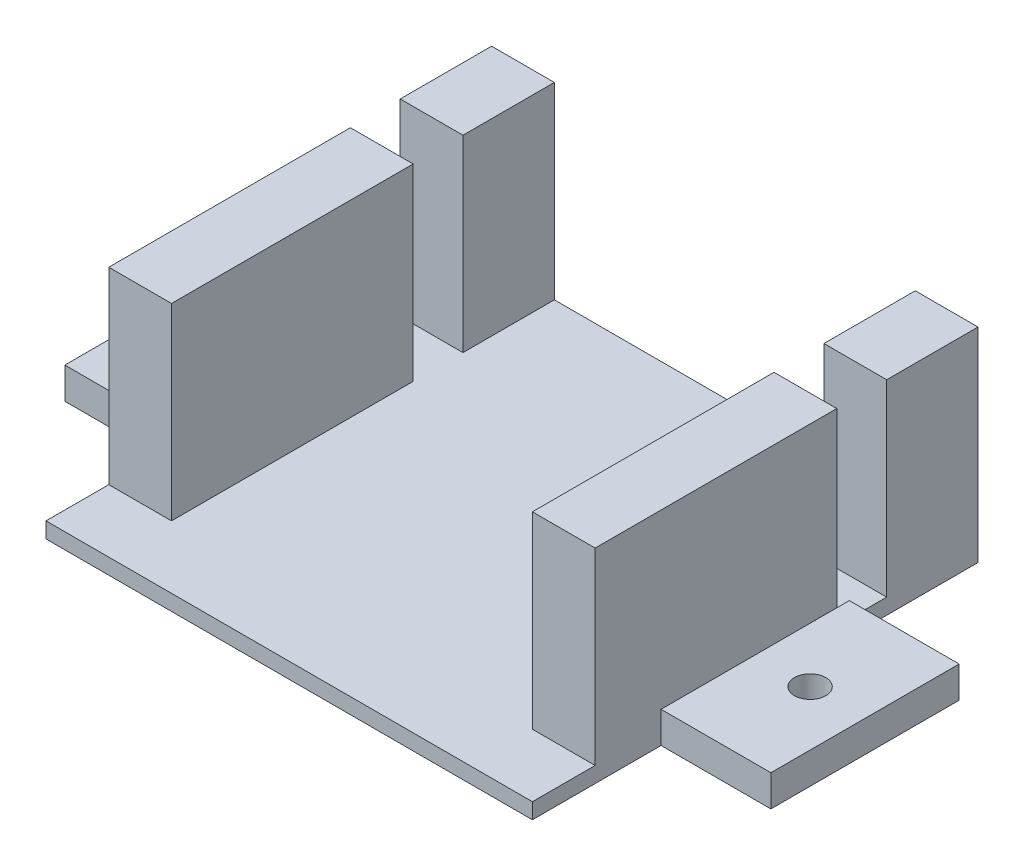
ISO-10303-21;
HEADER;
FILE_DESCRIPTION(('STEP AP214'),'2;1');
FILE_NAME('part.step','',(''),(''),'','','');
FILE_SCHEMA(('AUTOMOTIVE_DESIGN { 1 0 10303 214 1 1 1 1 }'));
ENDSEC;
DATA;
#1=APPLICATION_CONTEXT('core data for automotive mechanical design processes');
#2=APPLICATION_PROTOCOL_DEFINITION('international standard','automotive_design',2000,#1);
#3=PRODUCT_CONTEXT('',#1,'mechanical');
#4=PRODUCT('Part','Part','',(#3));
#5=PRODUCT_RELATED_PRODUCT_CATEGORY('part','',(#4));
#6=PRODUCT_DEFINITION_FORMATION('','',#4);
#7=PRODUCT_DEFINITION_CONTEXT('part definition',#1,'design');
#8=PRODUCT_DEFINITION('design','',#6,#7);
#9=PRODUCT_DEFINITION_SHAPE('','',#8);
#10=(LENGTH_UNIT() NAMED_UNIT(*) SI_UNIT(.MILLI.,.METRE.));
#11=(NAMED_UNIT(*) PLANE_ANGLE_UNIT() SI_UNIT($,.RADIAN.));
#12=(NAMED_UNIT(*) SI_UNIT($,.STERADIAN.) SOLID_ANGLE_UNIT());
#13=UNCERTAINTY_MEASURE_WITH_UNIT(LENGTH_MEASURE(1.E-05),#10,'distance_accuracy_value','');
#14=(GEOMETRIC_REPRESENTATION_CONTEXT(3) GLOBAL_UNCERTAINTY_ASSIGNED_CONTEXT((#13)) GLOBAL_UNIT_ASSIGNED_CONTEXT((#10,
#11,#12)) REPRESENTATION_CONTEXT('',''));
#15=CARTESIAN_POINT('',(0.,0.,0.));
#16=DIRECTION('',(0.,0.,1.));
#17=DIRECTION('',(1.,0.,0.));
#18=AXIS2_PLACEMENT_3D('',#15,#16,#17);
#19=CARTESIAN_POINT('',(-15.5,1.,14.2));
#20=DIRECTION('',(1.,0.,0.));
#21=DIRECTION('',(0.,0.,-1.));
#22=AXIS2_PLACEMENT_3D('',#19,#20,#21);
#23=PLANE('',#22);
#24=DIRECTION('',(0.,-1.,0.));
#25=VECTOR('',#24,1.);
#26=CARTESIAN_POINT('',(-15.5,2.,-6.));
#27=LINE('',#26,#25);
#28=CARTESIAN_POINT('',(-15.5,1.,-6.));
#29=VERTEX_POINT('',#28);
#30=CARTESIAN_POINT('',(-15.5,0.,-6.));
#31=VERTEX_POINT('',#30);
#32=EDGE_CURVE('E11',#29,#31,#27,.T.);
#33=ORIENTED_EDGE('',*,*,#32,.F.);
#34=DIRECTION('',(0.,0.,1.));
#35=VECTOR('',#34,1.);
#36=CARTESIAN_POINT('',(-15.5,1.,14.2));
#37=LINE('',#36,#35);
#38=CARTESIAN_POINT('',(-15.5,1.,-8.375));
#39=VERTEX_POINT('',#38);
#40=EDGE_CURVE('E477',#39,#29,#37,.T.);
#41=ORIENTED_EDGE('',*,*,#40,.F.);
#42=DIRECTION('',(0.,-1.,0.));
#43=VECTOR('',#42,1.);
#44=CARTESIAN_POINT('',(-15.5,13.,-8.375));
#45=LINE('',#44,#43);
#46=CARTESIAN_POINT('',(-15.5,13.,-8.375));
#47=VERTEX_POINT('',#46);
#48=EDGE_CURVE('E369',#47,#39,#45,.T.);
#49=ORIENTED_EDGE('',*,*,#48,.F.);
#50=DIRECTION('',(0.,0.,1.));
#51=VECTOR('',#50,1.);
#52=CARTESIAN_POINT('',(-15.5,13.,-14.2));
#53=LINE('',#52,#51);
#54=CARTESIAN_POINT('',(-15.5,13.,-14.2));
#55=VERTEX_POINT('',#54);
#56=EDGE_CURVE('E398',#55,#47,#53,.T.);
#57=ORIENTED_EDGE('',*,*,#56,.F.);
#58=DIRECTION('',(0.,-1.,0.));
#59=VECTOR('',#58,1.);
#60=CARTESIAN_POINT('',(-15.5,1.,-14.2));
#61=LINE('',#60,#59);
#62=CARTESIAN_POINT('',(-15.5,0.,-14.2));
#63=VERTEX_POINT('',#62);
#64=EDGE_CURVE('E505',#55,#63,#61,.T.);
#65=ORIENTED_EDGE('',*,*,#64,.T.);
#66=DIRECTION('',(0.,0.,1.));
#67=VECTOR('',#66,1.);
#68=CARTESIAN_POINT('',(-15.5,0.,14.2));
#69=LINE('',#68,#67);
#70=EDGE_CURVE('E492',#63,#31,#69,.T.);
#71=ORIENTED_EDGE('',*,*,#70,.T.);
#72=EDGE_LOOP('',(#33,#41,#49,#57,#65,#71));
#73=FACE_BOUND('',#72,.T.);
#74=ADVANCED_FACE('F45',(#73),#23,.F.);
#75=DIRECTION('',(0.,0.,-1.));
#76=VECTOR('',#75,1.);
#77=CARTESIAN_POINT('',(-15.5,2.,-6.));
#78=LINE('',#77,#76);
#79=CARTESIAN_POINT('',(-15.5,2.,6.));
#80=VERTEX_POINT('',#79);
#81=CARTESIAN_POINT('',(-15.5,2.,-5.2));
#82=VERTEX_POINT('',#81);
#83=EDGE_CURVE('E260',#80,#82,#78,.T.);
#84=ORIENTED_EDGE('',*,*,#83,.F.);
#85=DIRECTION('',(0.,-1.,0.));
#86=VECTOR('',#85,1.);
#87=CARTESIAN_POINT('',(-15.5,2.,6.));
#88=LINE('',#87,#86);
#89=CARTESIAN_POINT('',(-15.5,0.,6.));
#90=VERTEX_POINT('',#89);
#91=EDGE_CURVE('E252',#80,#90,#88,.T.);
#92=ORIENTED_EDGE('',*,*,#91,.T.);
#93=CARTESIAN_POINT('',(-15.5,0.,14.2));
#94=VERTEX_POINT('',#93);
#95=EDGE_CURVE('E258',#90,#94,#69,.T.);
#96=ORIENTED_EDGE('',*,*,#95,.T.);
#97=DIRECTION('',(0.,-1.,0.));
#98=VECTOR('',#97,1.);
#99=CARTESIAN_POINT('',(-15.5,1.,14.2));
#100=LINE('',#99,#98);
#101=CARTESIAN_POINT('',(-15.5,0.999999999999997,14.2));
#102=VERTEX_POINT('',#101);
#103=EDGE_CURVE('E502',#102,#94,#100,.T.);
#104=ORIENTED_EDGE('',*,*,#103,.F.);
#105=DIRECTION('',(0.,0.,1.));
#106=VECTOR('',#105,1.);
#107=CARTESIAN_POINT('',(-15.5,0.999999999999997,10.2));
#108=LINE('',#107,#106);
#109=CARTESIAN_POINT('',(-15.5,0.999999999999997,10.2));
#110=VERTEX_POINT('',#109);
#111=EDGE_CURVE('E320',#110,#102,#108,.T.);
#112=ORIENTED_EDGE('',*,*,#111,.F.);
#113=DIRECTION('',(0.,1.,0.));
#114=VECTOR('',#113,1.);
#115=CARTESIAN_POINT('',(-15.5,-30.2569992161756,10.2));
#116=LINE('',#115,#114);
#117=CARTESIAN_POINT('',(-15.5,13.,10.2));
#118=VERTEX_POINT('',#117);
#119=EDGE_CURVE('E325',#110,#118,#116,.T.);
#120=ORIENTED_EDGE('',*,*,#119,.T.);
#121=DIRECTION('',(0.,0.,1.));
#122=VECTOR('',#121,1.);
#123=CARTESIAN_POINT('',(-15.5,13.,14.2));
#124=LINE('',#123,#122);
#125=CARTESIAN_POINT('',(-15.5,13.,-5.2));
#126=VERTEX_POINT('',#125);
#127=EDGE_CURVE('E442',#126,#118,#124,.T.);
#128=ORIENTED_EDGE('',*,*,#127,.F.);
#129=DIRECTION('',(0.,-1.,0.));
#130=VECTOR('',#129,1.);
#131=CARTESIAN_POINT('',(-15.5,13.,-5.2));
#132=LINE('',#131,#130);
#133=EDGE_CURVE('E459',#126,#82,#132,.T.);
#134=ORIENTED_EDGE('',*,*,#133,.T.);
#135=EDGE_LOOP('',(#84,#92,#96,#104,#112,#120,#128,#134));
#136=FACE_BOUND('',#135,.T.);
#137=ADVANCED_FACE('F560',(#136),#23,.F.);
#138=CARTESIAN_POINT('',(15.5,1.,14.2));
#139=DIRECTION('',(-1.,0.,0.));
#140=DIRECTION('',(0.,0.,1.));
#141=AXIS2_PLACEMENT_3D('',#138,#139,#140);
#142=PLANE('',#141);
#143=DIRECTION('',(0.,-1.,0.));
#144=VECTOR('',#143,1.);
#145=CARTESIAN_POINT('',(15.5,2.,6.));
#146=LINE('',#145,#144);
#147=CARTESIAN_POINT('',(15.5,2.,6.));
#148=VERTEX_POINT('',#147);
#149=CARTESIAN_POINT('',(15.5,0.,6.));
#150=VERTEX_POINT('',#149);
#151=EDGE_CURVE('E311',#148,#150,#146,.T.);
#152=ORIENTED_EDGE('',*,*,#151,.F.);
#153=DIRECTION('',(0.,0.,1.));
#154=VECTOR('',#153,1.);
#155=CARTESIAN_POINT('',(15.5,2.,-6.));
#156=LINE('',#155,#154);
#157=CARTESIAN_POINT('',(15.5,2.,-5.19999999999999));
#158=VERTEX_POINT('',#157);
#159=EDGE_CURVE('E55',#158,#148,#156,.T.);
#160=ORIENTED_EDGE('',*,*,#159,.F.);
#161=DIRECTION('',(0.,-1.,0.));
#162=VECTOR('',#161,1.);
#163=CARTESIAN_POINT('',(15.5,13.,-5.2));
#164=LINE('',#163,#162);
#165=CARTESIAN_POINT('',(15.5,13.,-5.2));
#166=VERTEX_POINT('',#165);
#167=EDGE_CURVE('E415',#166,#158,#164,.T.);
#168=ORIENTED_EDGE('',*,*,#167,.F.);
#169=DIRECTION('',(0.,0.,-1.));
#170=VECTOR('',#169,1.);
#171=CARTESIAN_POINT('',(15.5,13.,14.2));
#172=LINE('',#171,#170);
#173=CARTESIAN_POINT('',(15.5,13.,10.2));
#174=VERTEX_POINT('',#173);
#175=EDGE_CURVE('E429',#174,#166,#172,.T.);
#176=ORIENTED_EDGE('',*,*,#175,.F.);
#177=DIRECTION('',(0.,1.,0.));
#178=VECTOR('',#177,1.);
#179=CARTESIAN_POINT('',(15.5,-30.2569992161756,10.2));
#180=LINE('',#179,#178);
#181=CARTESIAN_POINT('',(15.5,0.999999999999997,10.2));
#182=VERTEX_POINT('',#181);
#183=EDGE_CURVE('E334',#182,#174,#180,.T.);
#184=ORIENTED_EDGE('',*,*,#183,.F.);
#185=DIRECTION('',(0.,0.,-1.));
#186=VECTOR('',#185,1.);
#187=CARTESIAN_POINT('',(15.5,0.999999999999997,10.2));
#188=LINE('',#187,#186);
#189=CARTESIAN_POINT('',(15.5,0.999999999999997,14.2));
#190=VERTEX_POINT('',#189);
#191=EDGE_CURVE('E319',#190,#182,#188,.T.);
#192=ORIENTED_EDGE('',*,*,#191,.F.);
#193=DIRECTION('',(0.,-1.,0.));
#194=VECTOR('',#193,1.);
#195=CARTESIAN_POINT('',(15.5,1.,14.2));
#196=LINE('',#195,#194);
#197=CARTESIAN_POINT('',(15.5,0.,14.2));
#198=VERTEX_POINT('',#197);
#199=EDGE_CURVE('E484',#190,#198,#196,.T.);
#200=ORIENTED_EDGE('',*,*,#199,.T.);
#201=DIRECTION('',(0.,0.,-1.));
#202=VECTOR('',#201,1.);
#203=CARTESIAN_POINT('',(15.5,0.,14.2));
#204=LINE('',#203,#202);
#205=EDGE_CURVE('E485',#198,#150,#204,.T.);
#206=ORIENTED_EDGE('',*,*,#205,.T.);
#207=EDGE_LOOP('',(#152,#160,#168,#176,#184,#192,#200,#206));
#208=FACE_BOUND('',#207,.T.);
#209=ADVANCED_FACE('F532',(#208),#142,.F.);
#210=CARTESIAN_POINT('',(0.,1.,0.));
#211=DIRECTION('',(0.,-1.,0.));
#212=DIRECTION('',(0.,0.,-1.));
#213=AXIS2_PLACEMENT_3D('',#210,#211,#212);
#214=PLANE('',#213);
#215=DIRECTION('',(0.,0.,-1.));
#216=VECTOR('',#215,1.);
#217=CARTESIAN_POINT('',(-11.5,1.,14.2));
#218=LINE('',#217,#216);
#219=CARTESIAN_POINT('',(-11.5,0.999999999999997,10.2));
#220=VERTEX_POINT('',#219);
#221=CARTESIAN_POINT('',(-11.5,1.,-5.2));
#222=VERTEX_POINT('',#221);
#223=EDGE_CURVE('E433',#220,#222,#218,.T.);
#224=ORIENTED_EDGE('',*,*,#223,.F.);
#225=DIRECTION('',(-1.,0.,0.));
#226=VECTOR('',#225,1.);
#227=CARTESIAN_POINT('',(-15.5,0.999999999999997,10.2));
#228=LINE('',#227,#226);
#229=EDGE_CURVE('E330',#220,#110,#228,.T.);
#230=ORIENTED_EDGE('',*,*,#229,.T.);
#231=ORIENTED_EDGE('',*,*,#111,.T.);
#232=DIRECTION('',(1.,0.,0.));
#233=VECTOR('',#232,1.);
#234=CARTESIAN_POINT('',(-15.5,1.,14.2));
#235=LINE('',#234,#233);
#236=EDGE_CURVE('E481',#102,#190,#235,.T.);
#237=ORIENTED_EDGE('',*,*,#236,.T.);
#238=ORIENTED_EDGE('',*,*,#191,.T.);
#239=CARTESIAN_POINT('',(11.5,0.999999999999997,10.2));
#240=VERTEX_POINT('',#239);
#241=EDGE_CURVE('E326',#182,#240,#228,.T.);
#242=ORIENTED_EDGE('',*,*,#241,.T.);
#243=DIRECTION('',(0.,0.,1.));
#244=VECTOR('',#243,1.);
#245=CARTESIAN_POINT('',(11.5,1.,14.2));
#246=LINE('',#245,#244);
#247=CARTESIAN_POINT('',(11.5,1.,-5.2));
#248=VERTEX_POINT('',#247);
#249=EDGE_CURVE('E424',#248,#240,#246,.T.);
#250=ORIENTED_EDGE('',*,*,#249,.F.);
#251=DIRECTION('',(-1.,0.,0.));
#252=VECTOR('',#251,1.);
#253=CARTESIAN_POINT('',(15.5,1.,-5.2));
#254=LINE('',#253,#252);
#255=CARTESIAN_POINT('',(15.5,1.,-5.19999999999999));
#256=VERTEX_POINT('',#255);
#257=EDGE_CURVE('E428',#256,#248,#254,.T.);
#258=ORIENTED_EDGE('',*,*,#257,.F.);
#259=DIRECTION('',(0.,0.,-1.));
#260=VECTOR('',#259,1.);
#261=CARTESIAN_POINT('',(15.5,1.,14.2));
#262=LINE('',#261,#260);
#263=CARTESIAN_POINT('',(15.5,1.,-6.));
#264=VERTEX_POINT('',#263);
#265=EDGE_CURVE('E468',#256,#264,#262,.T.);
#266=ORIENTED_EDGE('',*,*,#265,.T.);
#267=CARTESIAN_POINT('',(15.5,1.,-8.38));
#268=VERTEX_POINT('',#267);
#269=EDGE_CURVE('E473',#264,#268,#262,.T.);
#270=ORIENTED_EDGE('',*,*,#269,.T.);
#271=DIRECTION('',(1.,0.,0.));
#272=VECTOR('',#271,1.);
#273=CARTESIAN_POINT('',(15.5,1.,-8.38));
#274=LINE('',#273,#272);
#275=CARTESIAN_POINT('',(11.5,1.,-8.38));
#276=VERTEX_POINT('',#275);
#277=EDGE_CURVE('E360',#276,#268,#274,.T.);
#278=ORIENTED_EDGE('',*,*,#277,.F.);
#279=DIRECTION('',(0.,0.,1.));
#280=VECTOR('',#279,1.);
#281=CARTESIAN_POINT('',(11.5,1.,-14.2));
#282=LINE('',#281,#280);
#283=CARTESIAN_POINT('',(11.5,1.,-14.2));
#284=VERTEX_POINT('',#283);
#285=EDGE_CURVE('E364',#284,#276,#282,.T.);
#286=ORIENTED_EDGE('',*,*,#285,.F.);
#287=DIRECTION('',(-1.,0.,0.));
#288=VECTOR('',#287,1.);
#289=CARTESIAN_POINT('',(-15.5,1.,-14.2));
#290=LINE('',#289,#288);
#291=CARTESIAN_POINT('',(-11.5,1.,-14.2));
#292=VERTEX_POINT('',#291);
#293=EDGE_CURVE('E472',#284,#292,#290,.T.);
#294=ORIENTED_EDGE('',*,*,#293,.T.);
#295=DIRECTION('',(0.,0.,-1.));
#296=VECTOR('',#295,1.);
#297=CARTESIAN_POINT('',(-11.5,1.,-14.2));
#298=LINE('',#297,#296);
#299=CARTESIAN_POINT('',(-11.5,1.,-8.375));
#300=VERTEX_POINT('',#299);
#301=EDGE_CURVE('E393',#300,#292,#298,.T.);
#302=ORIENTED_EDGE('',*,*,#301,.F.);
#303=DIRECTION('',(1.,0.,0.));
#304=VECTOR('',#303,1.);
#305=CARTESIAN_POINT('',(-15.5,1.,-8.375));
#306=LINE('',#305,#304);
#307=EDGE_CURVE('E397',#39,#300,#306,.T.);
#308=ORIENTED_EDGE('',*,*,#307,.F.);
#309=ORIENTED_EDGE('',*,*,#40,.T.);
#310=CARTESIAN_POINT('',(-15.5,1.,-5.2));
#311=VERTEX_POINT('',#310);
#312=EDGE_CURVE('E476',#29,#311,#37,.T.);
#313=ORIENTED_EDGE('',*,*,#312,.T.);
#314=DIRECTION('',(-1.,0.,0.));
#315=VECTOR('',#314,1.);
#316=CARTESIAN_POINT('',(-15.5,1.,-5.2));
#317=LINE('',#316,#315);
#318=EDGE_CURVE('E447',#222,#311,#317,.T.);
#319=ORIENTED_EDGE('',*,*,#318,.F.);
#320=EDGE_LOOP('',(#224,#230,#231,#237,#238,#242,#250,#258,#266,#270,#278,#286,#294,#302,#308,
#309,#313,#319));
#321=FACE_BOUND('',#320,.T.);
#322=ADVANCED_FACE('F635',(#321),#214,.F.);
#323=ORIENTED_EDGE('',*,*,#269,.F.);
#324=DIRECTION('',(0.,-1.,0.));
#325=VECTOR('',#324,1.);
#326=CARTESIAN_POINT('',(15.5,2.,-6.));
#327=LINE('',#326,#325);
#328=CARTESIAN_POINT('',(15.5,0.,-6.));
#329=VERTEX_POINT('',#328);
#330=EDGE_CURVE('E304',#264,#329,#327,.T.);
#331=ORIENTED_EDGE('',*,*,#330,.T.);
#332=CARTESIAN_POINT('',(15.5,0.,-14.2));
#333=VERTEX_POINT('',#332);
#334=EDGE_CURVE('E467',#329,#333,#204,.T.);
#335=ORIENTED_EDGE('',*,*,#334,.T.);
#336=DIRECTION('',(0.,-1.,0.));
#337=VECTOR('',#336,1.);
#338=CARTESIAN_POINT('',(15.5,1.,-14.2));
#339=LINE('',#338,#337);
#340=CARTESIAN_POINT('',(15.5,13.,-14.2));
#341=VERTEX_POINT('',#340);
#342=EDGE_CURVE('E49',#341,#333,#339,.T.);
#343=ORIENTED_EDGE('',*,*,#342,.F.);
#344=DIRECTION('',(0.,0.,-1.));
#345=VECTOR('',#344,1.);
#346=CARTESIAN_POINT('',(15.5,13.,-14.2));
#347=LINE('',#346,#345);
#348=CARTESIAN_POINT('',(15.5,13.,-8.38));
#349=VERTEX_POINT('',#348);
#350=EDGE_CURVE('E365',#349,#341,#347,.T.);
#351=ORIENTED_EDGE('',*,*,#350,.F.);
#352=DIRECTION('',(0.,-1.,0.));
#353=VECTOR('',#352,1.);
#354=CARTESIAN_POINT('',(15.5,13.,-8.38));
#355=LINE('',#354,#353);
#356=EDGE_CURVE('E355',#349,#268,#355,.T.);
#357=ORIENTED_EDGE('',*,*,#356,.T.);
#358=EDGE_LOOP('',(#323,#331,#335,#343,#351,#357));
#359=FACE_BOUND('',#358,.T.);
#360=ADVANCED_FACE('F47',(#359),#142,.F.);
#361=CARTESIAN_POINT('',(-15.5,1.,-14.2));
#362=DIRECTION('',(0.,0.,1.));
#363=DIRECTION('',(1.,0.,0.));
#364=AXIS2_PLACEMENT_3D('',#361,#362,#363);
#365=PLANE('',#364);
#366=DIRECTION('',(-1.,0.,0.));
#367=VECTOR('',#366,1.);
#368=CARTESIAN_POINT('',(-15.5,0.,-14.2));
#369=LINE('',#368,#367);
#370=EDGE_CURVE('E489',#333,#63,#369,.T.);
#371=ORIENTED_EDGE('',*,*,#370,.T.);
#372=ORIENTED_EDGE('',*,*,#64,.F.);
#373=DIRECTION('',(-1.,0.,0.));
#374=VECTOR('',#373,1.);
#375=CARTESIAN_POINT('',(-15.5,13.,-14.2));
#376=LINE('',#375,#374);
#377=CARTESIAN_POINT('',(-11.5,13.,-14.2));
#378=VERTEX_POINT('',#377);
#379=EDGE_CURVE('E392',#378,#55,#376,.T.);
#380=ORIENTED_EDGE('',*,*,#379,.F.);
#381=DIRECTION('',(0.,-1.,0.));
#382=VECTOR('',#381,1.);
#383=CARTESIAN_POINT('',(-11.5,13.,-14.2));
#384=LINE('',#383,#382);
#385=EDGE_CURVE('E388',#378,#292,#384,.T.);
#386=ORIENTED_EDGE('',*,*,#385,.T.);
#387=ORIENTED_EDGE('',*,*,#293,.F.);
#388=DIRECTION('',(0.,-1.,0.));
#389=VECTOR('',#388,1.);
#390=CARTESIAN_POINT('',(11.5,13.,-14.2));
#391=LINE('',#390,#389);
#392=CARTESIAN_POINT('',(11.5,13.,-14.2));
#393=VERTEX_POINT('',#392);
#394=EDGE_CURVE('E347',#393,#284,#391,.T.);
#395=ORIENTED_EDGE('',*,*,#394,.F.);
#396=DIRECTION('',(-1.,0.,0.));
#397=VECTOR('',#396,1.);
#398=CARTESIAN_POINT('',(15.5,13.,-14.2));
#399=LINE('',#398,#397);
#400=EDGE_CURVE('E375',#341,#393,#399,.T.);
#401=ORIENTED_EDGE('',*,*,#400,.F.);
#402=ORIENTED_EDGE('',*,*,#342,.T.);
#403=EDGE_LOOP('',(#371,#372,#380,#386,#387,#395,#401,#402));
#404=FACE_BOUND('',#403,.T.);
#405=ADVANCED_FACE('F627',(#404),#365,.F.);
#406=CARTESIAN_POINT('',(-15.5,1.,14.2));
#407=DIRECTION('',(0.,0.,-1.));
#408=DIRECTION('',(-1.,0.,0.));
#409=AXIS2_PLACEMENT_3D('',#406,#407,#408);
#410=PLANE('',#409);
#411=ORIENTED_EDGE('',*,*,#199,.F.);
#412=ORIENTED_EDGE('',*,*,#236,.F.);
#413=ORIENTED_EDGE('',*,*,#103,.T.);
#414=DIRECTION('',(1.,0.,0.));
#415=VECTOR('',#414,1.);
#416=CARTESIAN_POINT('',(-15.5,0.,14.2));
#417=LINE('',#416,#415);
#418=EDGE_CURVE('E496',#94,#198,#417,.T.);
#419=ORIENTED_EDGE('',*,*,#418,.T.);
#420=EDGE_LOOP('',(#411,#412,#413,#419));
#421=FACE_BOUND('',#420,.T.);
#422=ADVANCED_FACE('F625',(#421),#410,.F.);
#423=CARTESIAN_POINT('',(0.,0.,0.));
#424=DIRECTION('',(0.,-1.,0.));
#425=DIRECTION('',(0.,0.,-1.));
#426=AXIS2_PLACEMENT_3D('',#423,#424,#425);
#427=PLANE('',#426);
#428=CARTESIAN_POINT('',(-19.,0.,0.));
#429=DIRECTION('',(0.,1.,0.));
#430=DIRECTION('',(0.,0.,1.));
#431=AXIS2_PLACEMENT_3D('',#428,#429,#430);
#432=CIRCLE('',#431,1.);
#433=CARTESIAN_POINT('',(-19.,0.,1.));
#434=VERTEX_POINT('',#433);
#435=EDGE_CURVE('E578',#434,#434,#432,.T.);
#436=ORIENTED_EDGE('',*,*,#435,.T.);
#437=EDGE_LOOP('',(#436));
#438=FACE_BOUND('',#437,.T.);
#439=CARTESIAN_POINT('',(19.,0.,0.));
#440=DIRECTION('',(0.,1.,0.));
#441=DIRECTION('',(0.,0.,-1.));
#442=AXIS2_PLACEMENT_3D('',#439,#440,#441);
#443=CIRCLE('',#442,1.);
#444=CARTESIAN_POINT('',(19.,0.,-1.));
#445=VERTEX_POINT('',#444);
#446=EDGE_CURVE('E589',#445,#445,#443,.T.);
#447=ORIENTED_EDGE('',*,*,#446,.T.);
#448=EDGE_LOOP('',(#447));
#449=FACE_BOUND('',#448,.T.);
#450=ORIENTED_EDGE('',*,*,#205,.F.);
#451=ORIENTED_EDGE('',*,*,#418,.F.);
#452=ORIENTED_EDGE('',*,*,#95,.F.);
#453=DIRECTION('',(1.,0.,0.));
#454=VECTOR('',#453,1.);
#455=CARTESIAN_POINT('',(-15.5,0.,6.));
#456=LINE('',#455,#454);
#457=CARTESIAN_POINT('',(-22.5,0.,6.));
#458=VERTEX_POINT('',#457);
#459=EDGE_CURVE('E64',#458,#90,#456,.T.);
#460=ORIENTED_EDGE('',*,*,#459,.F.);
#461=DIRECTION('',(0.,0.,1.));
#462=VECTOR('',#461,1.);
#463=CARTESIAN_POINT('',(-22.5,0.,-6.));
#464=LINE('',#463,#462);
#465=CARTESIAN_POINT('',(-22.5,0.,-6.));
#466=VERTEX_POINT('',#465);
#467=EDGE_CURVE('E237',#466,#458,#464,.T.);
#468=ORIENTED_EDGE('',*,*,#467,.F.);
#469=DIRECTION('',(-1.,0.,0.));
#470=VECTOR('',#469,1.);
#471=CARTESIAN_POINT('',(-15.5,0.,-6.));
#472=LINE('',#471,#470);
#473=EDGE_CURVE('E247',#31,#466,#472,.T.);
#474=ORIENTED_EDGE('',*,*,#473,.F.);
#475=ORIENTED_EDGE('',*,*,#70,.F.);
#476=ORIENTED_EDGE('',*,*,#370,.F.);
#477=ORIENTED_EDGE('',*,*,#334,.F.);
#478=DIRECTION('',(-1.,0.,0.));
#479=VECTOR('',#478,1.);
#480=CARTESIAN_POINT('',(15.5,0.,-6.));
#481=LINE('',#480,#479);
#482=CARTESIAN_POINT('',(22.5,0.,-6.));
#483=VERTEX_POINT('',#482);
#484=EDGE_CURVE('E72',#483,#329,#481,.T.);
#485=ORIENTED_EDGE('',*,*,#484,.F.);
#486=DIRECTION('',(0.,0.,-1.));
#487=VECTOR('',#486,1.);
#488=CARTESIAN_POINT('',(22.5,0.,-6.));
#489=LINE('',#488,#487);
#490=CARTESIAN_POINT('',(22.5,0.,6.));
#491=VERTEX_POINT('',#490);
#492=EDGE_CURVE('E295',#491,#483,#489,.T.);
#493=ORIENTED_EDGE('',*,*,#492,.F.);
#494=DIRECTION('',(1.,0.,0.));
#495=VECTOR('',#494,1.);
#496=CARTESIAN_POINT('',(15.5,0.,6.));
#497=LINE('',#496,#495);
#498=EDGE_CURVE('E270',#150,#491,#497,.T.);
#499=ORIENTED_EDGE('',*,*,#498,.F.);
#500=EDGE_LOOP('',(#450,#451,#452,#460,#468,#474,#475,#476,#477,#485,#493,#499));
#501=FACE_BOUND('',#500,.T.);
#502=ADVANCED_FACE('F256',(#438,#449,#501),#427,.T.);
#503=CARTESIAN_POINT('',(-11.5,13.,14.2));
#504=DIRECTION('',(-1.,0.,0.));
#505=DIRECTION('',(0.,0.,1.));
#506=AXIS2_PLACEMENT_3D('',#503,#504,#505);
#507=PLANE('',#506);
#508=DIRECTION('',(0.,0.,-1.));
#509=VECTOR('',#508,1.);
#510=CARTESIAN_POINT('',(-11.5,13.,14.2));
#511=LINE('',#510,#509);
#512=CARTESIAN_POINT('',(-11.5,13.,10.2));
#513=VERTEX_POINT('',#512);
#514=CARTESIAN_POINT('',(-11.5,13.,-5.2));
#515=VERTEX_POINT('',#514);
#516=EDGE_CURVE('E446',#513,#515,#511,.T.);
#517=ORIENTED_EDGE('',*,*,#516,.F.);
#518=DIRECTION('',(0.,-1.,0.));
#519=VECTOR('',#518,1.);
#520=CARTESIAN_POINT('',(-11.5,13.,10.2));
#521=LINE('',#520,#519);
#522=EDGE_CURVE('E343',#513,#220,#521,.T.);
#523=ORIENTED_EDGE('',*,*,#522,.T.);
#524=ORIENTED_EDGE('',*,*,#223,.T.);
#525=DIRECTION('',(0.,-1.,0.));
#526=VECTOR('',#525,1.);
#527=CARTESIAN_POINT('',(-11.5,13.,-5.2));
#528=LINE('',#527,#526);
#529=EDGE_CURVE('E463',#515,#222,#528,.T.);
#530=ORIENTED_EDGE('',*,*,#529,.F.);
#531=EDGE_LOOP('',(#517,#523,#524,#530));
#532=FACE_BOUND('',#531,.T.);
#533=ADVANCED_FACE('F681',(#532),#507,.F.);
#534=CARTESIAN_POINT('',(-15.5,13.,-5.2));
#535=DIRECTION('',(0.,0.,1.));
#536=DIRECTION('',(1.,0.,0.));
#537=AXIS2_PLACEMENT_3D('',#534,#535,#536);
#538=PLANE('',#537);
#539=ORIENTED_EDGE('',*,*,#318,.T.);
#540=EDGE_CURVE('E453',#82,#311,#132,.T.);
#541=ORIENTED_EDGE('',*,*,#540,.F.);
#542=ORIENTED_EDGE('',*,*,#133,.F.);
#543=DIRECTION('',(-1.,0.,0.));
#544=VECTOR('',#543,1.);
#545=CARTESIAN_POINT('',(-15.5,13.,-5.2));
#546=LINE('',#545,#544);
#547=EDGE_CURVE('E450',#515,#126,#546,.T.);
#548=ORIENTED_EDGE('',*,*,#547,.F.);
#549=ORIENTED_EDGE('',*,*,#529,.T.);
#550=EDGE_LOOP('',(#539,#541,#542,#548,#549));
#551=FACE_BOUND('',#550,.T.);
#552=ADVANCED_FACE('F568',(#551),#538,.F.);
#553=CARTESIAN_POINT('',(0.,13.,0.));
#554=DIRECTION('',(0.,-1.,0.));
#555=DIRECTION('',(0.,0.,-1.));
#556=AXIS2_PLACEMENT_3D('',#553,#554,#555);
#557=PLANE('',#556);
#558=ORIENTED_EDGE('',*,*,#127,.T.);
#559=DIRECTION('',(-1.,0.,0.));
#560=VECTOR('',#559,1.);
#561=CARTESIAN_POINT('',(-15.5,13.,10.2));
#562=LINE('',#561,#560);
#563=EDGE_CURVE('E315',#513,#118,#562,.T.);
#564=ORIENTED_EDGE('',*,*,#563,.F.);
#565=ORIENTED_EDGE('',*,*,#516,.T.);
#566=ORIENTED_EDGE('',*,*,#547,.T.);
#567=EDGE_LOOP('',(#558,#564,#565,#566));
#568=FACE_BOUND('',#567,.T.);
#569=ADVANCED_FACE('F562',(#568),#557,.F.);
#570=CARTESIAN_POINT('',(15.5,13.,-5.2));
#571=DIRECTION('',(0.,0.,1.));
#572=DIRECTION('',(1.,0.,0.));
#573=AXIS2_PLACEMENT_3D('',#570,#571,#572);
#574=PLANE('',#573);
#575=ORIENTED_EDGE('',*,*,#257,.T.);
#576=DIRECTION('',(0.,-1.,0.));
#577=VECTOR('',#576,1.);
#578=CARTESIAN_POINT('',(11.5,13.,-5.2));
#579=LINE('',#578,#577);
#580=CARTESIAN_POINT('',(11.5,13.,-5.2));
#581=VERTEX_POINT('',#580);
#582=EDGE_CURVE('E419',#581,#248,#579,.T.);
#583=ORIENTED_EDGE('',*,*,#582,.F.);
#584=DIRECTION('',(-1.,0.,0.));
#585=VECTOR('',#584,1.);
#586=CARTESIAN_POINT('',(15.5,13.,-5.2));
#587=LINE('',#586,#585);
#588=EDGE_CURVE('E437',#166,#581,#587,.T.);
#589=ORIENTED_EDGE('',*,*,#588,.F.);
#590=ORIENTED_EDGE('',*,*,#167,.T.);
#591=EDGE_CURVE('E402',#158,#256,#164,.T.);
#592=ORIENTED_EDGE('',*,*,#591,.T.);
#593=EDGE_LOOP('',(#575,#583,#589,#590,#592));
#594=FACE_BOUND('',#593,.T.);
#595=ADVANCED_FACE('F667',(#594),#574,.F.);
#596=CARTESIAN_POINT('',(11.5,13.,14.2));
#597=DIRECTION('',(1.,0.,0.));
#598=DIRECTION('',(0.,0.,-1.));
#599=AXIS2_PLACEMENT_3D('',#596,#597,#598);
#600=PLANE('',#599);
#601=ORIENTED_EDGE('',*,*,#249,.T.);
#602=DIRECTION('',(0.,1.,0.));
#603=VECTOR('',#602,1.);
#604=CARTESIAN_POINT('',(11.5,13.,10.2));
#605=LINE('',#604,#603);
#606=CARTESIAN_POINT('',(11.5,13.,10.2));
#607=VERTEX_POINT('',#606);
#608=EDGE_CURVE('E324',#240,#607,#605,.T.);
#609=ORIENTED_EDGE('',*,*,#608,.T.);
#610=DIRECTION('',(0.,0.,1.));
#611=VECTOR('',#610,1.);
#612=CARTESIAN_POINT('',(11.5,13.,14.2));
#613=LINE('',#612,#611);
#614=EDGE_CURVE('E423',#581,#607,#613,.T.);
#615=ORIENTED_EDGE('',*,*,#614,.F.);
#616=ORIENTED_EDGE('',*,*,#582,.T.);
#617=EDGE_LOOP('',(#601,#609,#615,#616));
#618=FACE_BOUND('',#617,.T.);
#619=ADVANCED_FACE('F670',(#618),#600,.F.);
#620=CARTESIAN_POINT('',(0.,13.,0.));
#621=DIRECTION('',(0.,1.,0.));
#622=DIRECTION('',(0.,0.,1.));
#623=AXIS2_PLACEMENT_3D('',#620,#621,#622);
#624=PLANE('',#623);
#625=EDGE_CURVE('E316',#174,#607,#562,.T.);
#626=ORIENTED_EDGE('',*,*,#625,.F.);
#627=ORIENTED_EDGE('',*,*,#175,.T.);
#628=ORIENTED_EDGE('',*,*,#588,.T.);
#629=ORIENTED_EDGE('',*,*,#614,.T.);
#630=EDGE_LOOP('',(#626,#627,#628,#629));
#631=FACE_BOUND('',#630,.T.);
#632=ADVANCED_FACE('F663',(#631),#624,.T.);
#633=CARTESIAN_POINT('',(-15.5,13.,-8.375));
#634=DIRECTION('',(0.,0.,-1.));
#635=DIRECTION('',(-1.,0.,0.));
#636=AXIS2_PLACEMENT_3D('',#633,#634,#635);
#637=PLANE('',#636);
#638=ORIENTED_EDGE('',*,*,#307,.T.);
#639=DIRECTION('',(0.,-1.,0.));
#640=VECTOR('',#639,1.);
#641=CARTESIAN_POINT('',(-11.5,13.,-8.375));
#642=LINE('',#641,#640);
#643=CARTESIAN_POINT('',(-11.5,13.,-8.375));
#644=VERTEX_POINT('',#643);
#645=EDGE_CURVE('E384',#644,#300,#642,.T.);
#646=ORIENTED_EDGE('',*,*,#645,.F.);
#647=DIRECTION('',(1.,0.,0.));
#648=VECTOR('',#647,1.);
#649=CARTESIAN_POINT('',(-15.5,13.,-8.375));
#650=LINE('',#649,#648);
#651=EDGE_CURVE('E409',#47,#644,#650,.T.);
#652=ORIENTED_EDGE('',*,*,#651,.F.);
#653=ORIENTED_EDGE('',*,*,#48,.T.);
#654=EDGE_LOOP('',(#638,#646,#652,#653));
#655=FACE_BOUND('',#654,.T.);
#656=ADVANCED_FACE('F647',(#655),#637,.F.);
#657=CARTESIAN_POINT('',(-11.5,13.,-14.2));
#658=DIRECTION('',(-1.,0.,0.));
#659=DIRECTION('',(0.,0.,1.));
#660=AXIS2_PLACEMENT_3D('',#657,#658,#659);
#661=PLANE('',#660);
#662=ORIENTED_EDGE('',*,*,#301,.T.);
#663=ORIENTED_EDGE('',*,*,#385,.F.);
#664=DIRECTION('',(0.,0.,-1.));
#665=VECTOR('',#664,1.);
#666=CARTESIAN_POINT('',(-11.5,13.,-14.2));
#667=LINE('',#666,#665);
#668=EDGE_CURVE('E406',#644,#378,#667,.T.);
#669=ORIENTED_EDGE('',*,*,#668,.F.);
#670=ORIENTED_EDGE('',*,*,#645,.T.);
#671=EDGE_LOOP('',(#662,#663,#669,#670));
#672=FACE_BOUND('',#671,.T.);
#673=ADVANCED_FACE('F655',(#672),#661,.F.);
#674=CARTESIAN_POINT('',(0.,13.,0.));
#675=DIRECTION('',(0.,1.,0.));
#676=DIRECTION('',(0.,0.,1.));
#677=AXIS2_PLACEMENT_3D('',#674,#675,#676);
#678=PLANE('',#677);
#679=ORIENTED_EDGE('',*,*,#56,.T.);
#680=ORIENTED_EDGE('',*,*,#651,.T.);
#681=ORIENTED_EDGE('',*,*,#668,.T.);
#682=ORIENTED_EDGE('',*,*,#379,.T.);
#683=EDGE_LOOP('',(#679,#680,#681,#682));
#684=FACE_BOUND('',#683,.T.);
#685=ADVANCED_FACE('F649',(#684),#678,.T.);
#686=CARTESIAN_POINT('',(11.5,13.,-14.2));
#687=DIRECTION('',(1.,0.,0.));
#688=DIRECTION('',(0.,0.,-1.));
#689=AXIS2_PLACEMENT_3D('',#686,#687,#688);
#690=PLANE('',#689);
#691=ORIENTED_EDGE('',*,*,#285,.T.);
#692=DIRECTION('',(0.,-1.,0.));
#693=VECTOR('',#692,1.);
#694=CARTESIAN_POINT('',(11.5,13.,-8.38));
#695=LINE('',#694,#693);
#696=CARTESIAN_POINT('',(11.5,13.,-8.38));
#697=VERTEX_POINT('',#696);
#698=EDGE_CURVE('E351',#697,#276,#695,.T.);
#699=ORIENTED_EDGE('',*,*,#698,.F.);
#700=DIRECTION('',(0.,0.,1.));
#701=VECTOR('',#700,1.);
#702=CARTESIAN_POINT('',(11.5,13.,-14.2));
#703=LINE('',#702,#701);
#704=EDGE_CURVE('E372',#393,#697,#703,.T.);
#705=ORIENTED_EDGE('',*,*,#704,.F.);
#706=ORIENTED_EDGE('',*,*,#394,.T.);
#707=EDGE_LOOP('',(#691,#699,#705,#706));
#708=FACE_BOUND('',#707,.T.);
#709=ADVANCED_FACE('F661',(#708),#690,.F.);
#710=CARTESIAN_POINT('',(15.5,13.,-8.38));
#711=DIRECTION('',(0.,0.,-1.));
#712=DIRECTION('',(-1.,0.,0.));
#713=AXIS2_PLACEMENT_3D('',#710,#711,#712);
#714=PLANE('',#713);
#715=ORIENTED_EDGE('',*,*,#277,.T.);
#716=ORIENTED_EDGE('',*,*,#356,.F.);
#717=DIRECTION('',(1.,0.,0.));
#718=VECTOR('',#717,1.);
#719=CARTESIAN_POINT('',(15.5,13.,-8.38));
#720=LINE('',#719,#718);
#721=EDGE_CURVE('E359',#697,#349,#720,.T.);
#722=ORIENTED_EDGE('',*,*,#721,.F.);
#723=ORIENTED_EDGE('',*,*,#698,.T.);
#724=EDGE_LOOP('',(#715,#716,#722,#723));
#725=FACE_BOUND('',#724,.T.);
#726=ADVANCED_FACE('F720',(#725),#714,.F.);
#727=CARTESIAN_POINT('',(0.,13.,0.));
#728=DIRECTION('',(0.,-1.,0.));
#729=DIRECTION('',(0.,0.,-1.));
#730=AXIS2_PLACEMENT_3D('',#727,#728,#729);
#731=PLANE('',#730);
#732=ORIENTED_EDGE('',*,*,#350,.T.);
#733=ORIENTED_EDGE('',*,*,#400,.T.);
#734=ORIENTED_EDGE('',*,*,#704,.T.);
#735=ORIENTED_EDGE('',*,*,#721,.T.);
#736=EDGE_LOOP('',(#732,#733,#734,#735));
#737=FACE_BOUND('',#736,.T.);
#738=ADVANCED_FACE('F715',(#737),#731,.F.);
#739=CARTESIAN_POINT('',(-15.5,-30.2569992161756,10.2));
#740=DIRECTION('',(0.,0.,-1.));
#741=DIRECTION('',(-1.,0.,0.));
#742=AXIS2_PLACEMENT_3D('',#739,#740,#741);
#743=PLANE('',#742);
#744=ORIENTED_EDGE('',*,*,#241,.F.);
#745=ORIENTED_EDGE('',*,*,#183,.T.);
#746=ORIENTED_EDGE('',*,*,#625,.T.);
#747=ORIENTED_EDGE('',*,*,#608,.F.);
#748=EDGE_LOOP('',(#744,#745,#746,#747));
#749=FACE_BOUND('',#748,.T.);
#750=ADVANCED_FACE('F728',(#749),#743,.F.);
#751=ORIENTED_EDGE('',*,*,#563,.T.);
#752=ORIENTED_EDGE('',*,*,#119,.F.);
#753=ORIENTED_EDGE('',*,*,#229,.F.);
#754=ORIENTED_EDGE('',*,*,#522,.F.);
#755=EDGE_LOOP('',(#751,#752,#753,#754));
#756=FACE_BOUND('',#755,.T.);
#757=ADVANCED_FACE('F553',(#756),#743,.F.);
#758=CARTESIAN_POINT('',(15.5,2.,-6.));
#759=DIRECTION('',(1.,0.,0.));
#760=DIRECTION('',(0.,0.,-1.));
#761=AXIS2_PLACEMENT_3D('',#758,#759,#760);
#762=PLANE('',#761);
#763=ORIENTED_EDGE('',*,*,#265,.F.);
#764=ORIENTED_EDGE('',*,*,#591,.F.);
#765=CARTESIAN_POINT('',(15.5,2.,-6.));
#766=VERTEX_POINT('',#765);
#767=EDGE_CURVE('E279',#766,#158,#156,.T.);
#768=ORIENTED_EDGE('',*,*,#767,.F.);
#769=EDGE_CURVE('E292',#766,#264,#327,.T.);
#770=ORIENTED_EDGE('',*,*,#769,.T.);
#771=EDGE_LOOP('',(#763,#764,#768,#770));
#772=FACE_BOUND('',#771,.T.);
#773=ADVANCED_FACE('F543',(#772),#762,.F.);
#774=CARTESIAN_POINT('',(15.5,2.,6.));
#775=DIRECTION('',(0.,0.,-1.));
#776=DIRECTION('',(-1.,0.,0.));
#777=AXIS2_PLACEMENT_3D('',#774,#775,#776);
#778=PLANE('',#777);
#779=ORIENTED_EDGE('',*,*,#498,.T.);
#780=DIRECTION('',(0.,-1.,0.));
#781=VECTOR('',#780,1.);
#782=CARTESIAN_POINT('',(22.5,2.,6.));
#783=LINE('',#782,#781);
#784=CARTESIAN_POINT('',(22.5,2.,6.));
#785=VERTEX_POINT('',#784);
#786=EDGE_CURVE('E307',#785,#491,#783,.T.);
#787=ORIENTED_EDGE('',*,*,#786,.F.);
#788=DIRECTION('',(1.,0.,0.));
#789=VECTOR('',#788,1.);
#790=CARTESIAN_POINT('',(15.5,2.,6.));
#791=LINE('',#790,#789);
#792=EDGE_CURVE('E283',#148,#785,#791,.T.);
#793=ORIENTED_EDGE('',*,*,#792,.F.);
#794=ORIENTED_EDGE('',*,*,#151,.T.);
#795=EDGE_LOOP('',(#779,#787,#793,#794));
#796=FACE_BOUND('',#795,.T.);
#797=ADVANCED_FACE('F530',(#796),#778,.F.);
#798=CARTESIAN_POINT('',(22.5,2.,-6.));
#799=DIRECTION('',(-1.,0.,0.));
#800=DIRECTION('',(0.,0.,1.));
#801=AXIS2_PLACEMENT_3D('',#798,#799,#800);
#802=PLANE('',#801);
#803=ORIENTED_EDGE('',*,*,#492,.T.);
#804=DIRECTION('',(0.,-1.,0.));
#805=VECTOR('',#804,1.);
#806=CARTESIAN_POINT('',(22.5,2.,-6.));
#807=LINE('',#806,#805);
#808=CARTESIAN_POINT('',(22.5,2.,-6.));
#809=VERTEX_POINT('',#808);
#810=EDGE_CURVE('E303',#809,#483,#807,.T.);
#811=ORIENTED_EDGE('',*,*,#810,.F.);
#812=DIRECTION('',(0.,0.,-1.));
#813=VECTOR('',#812,1.);
#814=CARTESIAN_POINT('',(22.5,2.,-6.));
#815=LINE('',#814,#813);
#816=EDGE_CURVE('E286',#785,#809,#815,.T.);
#817=ORIENTED_EDGE('',*,*,#816,.F.);
#818=ORIENTED_EDGE('',*,*,#786,.T.);
#819=EDGE_LOOP('',(#803,#811,#817,#818));
#820=FACE_BOUND('',#819,.T.);
#821=ADVANCED_FACE('F537',(#820),#802,.F.);
#822=CARTESIAN_POINT('',(15.5,2.,-6.));
#823=DIRECTION('',(0.,0.,1.));
#824=DIRECTION('',(1.,0.,0.));
#825=AXIS2_PLACEMENT_3D('',#822,#823,#824);
#826=PLANE('',#825);
#827=ORIENTED_EDGE('',*,*,#484,.T.);
#828=ORIENTED_EDGE('',*,*,#330,.F.);
#829=ORIENTED_EDGE('',*,*,#769,.F.);
#830=DIRECTION('',(-1.,0.,0.));
#831=VECTOR('',#830,1.);
#832=CARTESIAN_POINT('',(15.5,2.,-6.));
#833=LINE('',#832,#831);
#834=EDGE_CURVE('E289',#809,#766,#833,.T.);
#835=ORIENTED_EDGE('',*,*,#834,.F.);
#836=ORIENTED_EDGE('',*,*,#810,.T.);
#837=EDGE_LOOP('',(#827,#828,#829,#835,#836));
#838=FACE_BOUND('',#837,.T.);
#839=ADVANCED_FACE('F541',(#838),#826,.F.);
#840=CARTESIAN_POINT('',(0.,2.,0.));
#841=DIRECTION('',(0.,1.,0.));
#842=DIRECTION('',(0.,0.,1.));
#843=AXIS2_PLACEMENT_3D('',#840,#841,#842);
#844=PLANE('',#843);
#845=CARTESIAN_POINT('',(19.,2.,0.));
#846=DIRECTION('',(0.,1.,0.));
#847=DIRECTION('',(0.,0.,-1.));
#848=AXIS2_PLACEMENT_3D('',#845,#846,#847);
#849=CIRCLE('',#848,1.);
#850=CARTESIAN_POINT('',(19.,2.,-1.));
#851=VERTEX_POINT('',#850);
#852=EDGE_CURVE('E585',#851,#851,#849,.T.);
#853=ORIENTED_EDGE('',*,*,#852,.F.);
#854=EDGE_LOOP('',(#853));
#855=FACE_BOUND('',#854,.T.);
#856=ORIENTED_EDGE('',*,*,#767,.T.);
#857=ORIENTED_EDGE('',*,*,#159,.T.);
#858=ORIENTED_EDGE('',*,*,#792,.T.);
#859=ORIENTED_EDGE('',*,*,#816,.T.);
#860=ORIENTED_EDGE('',*,*,#834,.T.);
#861=EDGE_LOOP('',(#856,#857,#858,#859,#860));
#862=FACE_BOUND('',#861,.T.);
#863=ADVANCED_FACE('F523',(#855,#862),#844,.T.);
#864=CARTESIAN_POINT('',(-15.5,2.,-6.));
#865=DIRECTION('',(-1.,0.,0.));
#866=DIRECTION('',(0.,0.,1.));
#867=AXIS2_PLACEMENT_3D('',#864,#865,#866);
#868=PLANE('',#867);
#869=CARTESIAN_POINT('',(-15.5,2.,-6.));
#870=VERTEX_POINT('',#869);
#871=EDGE_CURVE('E264',#82,#870,#78,.T.);
#872=ORIENTED_EDGE('',*,*,#871,.F.);
#873=ORIENTED_EDGE('',*,*,#540,.T.);
#874=ORIENTED_EDGE('',*,*,#312,.F.);
#875=EDGE_CURVE('E57',#870,#29,#27,.T.);
#876=ORIENTED_EDGE('',*,*,#875,.F.);
#877=EDGE_LOOP('',(#872,#873,#874,#876));
#878=FACE_BOUND('',#877,.T.);
#879=ADVANCED_FACE('F604',(#878),#868,.F.);
#880=CARTESIAN_POINT('',(-15.5,2.,-6.));
#881=DIRECTION('',(0.,0.,1.));
#882=DIRECTION('',(1.,0.,0.));
#883=AXIS2_PLACEMENT_3D('',#880,#881,#882);
#884=PLANE('',#883);
#885=ORIENTED_EDGE('',*,*,#473,.T.);
#886=DIRECTION('',(0.,-1.,0.));
#887=VECTOR('',#886,1.);
#888=CARTESIAN_POINT('',(-22.5,2.,-6.));
#889=LINE('',#888,#887);
#890=CARTESIAN_POINT('',(-22.5,2.,-6.));
#891=VERTEX_POINT('',#890);
#892=EDGE_CURVE('E243',#891,#466,#889,.T.);
#893=ORIENTED_EDGE('',*,*,#892,.F.);
#894=DIRECTION('',(-1.,0.,0.));
#895=VECTOR('',#894,1.);
#896=CARTESIAN_POINT('',(-15.5,2.,-6.));
#897=LINE('',#896,#895);
#898=EDGE_CURVE('E276',#870,#891,#897,.T.);
#899=ORIENTED_EDGE('',*,*,#898,.F.);
#900=ORIENTED_EDGE('',*,*,#875,.T.);
#901=ORIENTED_EDGE('',*,*,#32,.T.);
#902=EDGE_LOOP('',(#885,#893,#899,#900,#901));
#903=FACE_BOUND('',#902,.T.);
#904=ADVANCED_FACE('F611',(#903),#884,.F.);
#905=CARTESIAN_POINT('',(-22.5,2.,-6.));
#906=DIRECTION('',(1.,0.,0.));
#907=DIRECTION('',(0.,0.,-1.));
#908=AXIS2_PLACEMENT_3D('',#905,#906,#907);
#909=PLANE('',#908);
#910=ORIENTED_EDGE('',*,*,#467,.T.);
#911=DIRECTION('',(0.,-1.,0.));
#912=VECTOR('',#911,1.);
#913=CARTESIAN_POINT('',(-22.5,2.,6.));
#914=LINE('',#913,#912);
#915=CARTESIAN_POINT('',(-22.5,2.,6.));
#916=VERTEX_POINT('',#915);
#917=EDGE_CURVE('E240',#916,#458,#914,.T.);
#918=ORIENTED_EDGE('',*,*,#917,.F.);
#919=DIRECTION('',(0.,0.,1.));
#920=VECTOR('',#919,1.);
#921=CARTESIAN_POINT('',(-22.5,2.,-6.));
#922=LINE('',#921,#920);
#923=EDGE_CURVE('E273',#891,#916,#922,.T.);
#924=ORIENTED_EDGE('',*,*,#923,.F.);
#925=ORIENTED_EDGE('',*,*,#892,.T.);
#926=EDGE_LOOP('',(#910,#918,#924,#925));
#927=FACE_BOUND('',#926,.T.);
#928=ADVANCED_FACE('F238',(#927),#909,.F.);
#929=CARTESIAN_POINT('',(-15.5,2.,6.));
#930=DIRECTION('',(0.,0.,-1.));
#931=DIRECTION('',(-1.,0.,0.));
#932=AXIS2_PLACEMENT_3D('',#929,#930,#931);
#933=PLANE('',#932);
#934=ORIENTED_EDGE('',*,*,#459,.T.);
#935=ORIENTED_EDGE('',*,*,#91,.F.);
#936=DIRECTION('',(1.,0.,0.));
#937=VECTOR('',#936,1.);
#938=CARTESIAN_POINT('',(-15.5,2.,6.));
#939=LINE('',#938,#937);
#940=EDGE_CURVE('E250',#916,#80,#939,.T.);
#941=ORIENTED_EDGE('',*,*,#940,.F.);
#942=ORIENTED_EDGE('',*,*,#917,.T.);
#943=EDGE_LOOP('',(#934,#935,#941,#942));
#944=FACE_BOUND('',#943,.T.);
#945=ADVANCED_FACE('F249',(#944),#933,.F.);
#946=CARTESIAN_POINT('',(0.,2.,0.));
#947=DIRECTION('',(0.,-1.,0.));
#948=DIRECTION('',(0.,0.,-1.));
#949=AXIS2_PLACEMENT_3D('',#946,#947,#948);
#950=PLANE('',#949);
#951=CARTESIAN_POINT('',(-19.,2.,0.));
#952=DIRECTION('',(0.,1.,0.));
#953=DIRECTION('',(0.,0.,1.));
#954=AXIS2_PLACEMENT_3D('',#951,#952,#953);
#955=CIRCLE('',#954,1.);
#956=CARTESIAN_POINT('',(-19.,2.,1.));
#957=VERTEX_POINT('',#956);
#958=EDGE_CURVE('E581',#957,#957,#955,.T.);
#959=ORIENTED_EDGE('',*,*,#958,.F.);
#960=EDGE_LOOP('',(#959));
#961=FACE_BOUND('',#960,.T.);
#962=ORIENTED_EDGE('',*,*,#83,.T.);
#963=ORIENTED_EDGE('',*,*,#871,.T.);
#964=ORIENTED_EDGE('',*,*,#898,.T.);
#965=ORIENTED_EDGE('',*,*,#923,.T.);
#966=ORIENTED_EDGE('',*,*,#940,.T.);
#967=EDGE_LOOP('',(#962,#963,#964,#965,#966));
#968=FACE_BOUND('',#967,.T.);
#969=ADVANCED_FACE('F570',(#961,#968),#950,.F.);
#970=CARTESIAN_POINT('',(-19.,0.,0.));
#971=DIRECTION('',(0.,1.,0.));
#972=DIRECTION('',(0.,0.,1.));
#973=AXIS2_PLACEMENT_3D('',#970,#971,#972);
#974=CYLINDRICAL_SURFACE('',#973,1.);
#975=ORIENTED_EDGE('',*,*,#435,.F.);
#976=EDGE_LOOP('',(#975));
#977=FACE_BOUND('',#976,.T.);
#978=ORIENTED_EDGE('',*,*,#958,.T.);
#979=EDGE_LOOP('',(#978));
#980=FACE_BOUND('',#979,.T.);
#981=ADVANCED_FACE('F599',(#977,#980),#974,.F.);
#982=CARTESIAN_POINT('',(19.,0.,0.));
#983=DIRECTION('',(0.,1.,0.));
#984=DIRECTION('',(0.,0.,1.));
#985=AXIS2_PLACEMENT_3D('',#982,#983,#984);
#986=CYLINDRICAL_SURFACE('',#985,1.);
#987=ORIENTED_EDGE('',*,*,#446,.F.);
#988=EDGE_LOOP('',(#987));
#989=FACE_BOUND('',#988,.T.);
#990=ORIENTED_EDGE('',*,*,#852,.T.);
#991=EDGE_LOOP('',(#990));
#992=FACE_BOUND('',#991,.T.);
#993=ADVANCED_FACE('F596',(#989,#992),#986,.F.);
#994=CLOSED_SHELL('',(#74,#137,#209,#322,#360,#405,#422,#502,#533,#552,#569,#595,#619,#632,#656,
#673,#685,#709,#726,#738,#750,#757,#773,#797,#821,#839,#863,#879,#904,#928,#945,#969,#981,#993));
#995=MANIFOLD_SOLID_BREP('B2',#994);
#996=ADVANCED_BREP_SHAPE_REPRESENTATION('',(#18,#995),#14);
#997=SHAPE_DEFINITION_REPRESENTATION(#9,#996);
ENDSEC;
END-ISO-10303-21;
